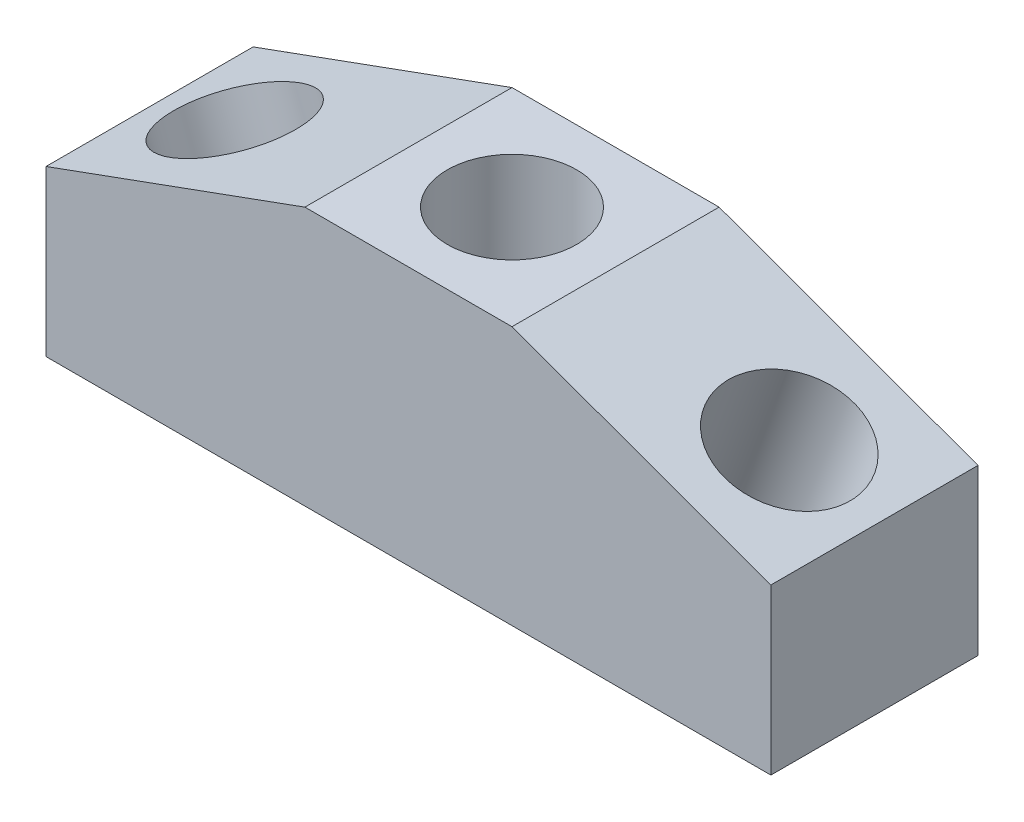
ISO-10303-21;
HEADER;
FILE_DESCRIPTION(('STEP AP214'),'2;1');
FILE_NAME('part.step','',(''),(''),'','','');
FILE_SCHEMA(('AUTOMOTIVE_DESIGN { 1 0 10303 214 1 1 1 1 }'));
ENDSEC;
DATA;
#1=APPLICATION_CONTEXT('core data for automotive mechanical design processes');
#2=APPLICATION_PROTOCOL_DEFINITION('international standard','automotive_design',2000,#1);
#3=PRODUCT_CONTEXT('',#1,'mechanical');
#4=PRODUCT('Part','Part','',(#3));
#5=PRODUCT_RELATED_PRODUCT_CATEGORY('part','',(#4));
#6=PRODUCT_DEFINITION_FORMATION('','',#4);
#7=PRODUCT_DEFINITION_CONTEXT('part definition',#1,'design');
#8=PRODUCT_DEFINITION('design','',#6,#7);
#9=PRODUCT_DEFINITION_SHAPE('','',#8);
#10=(LENGTH_UNIT() NAMED_UNIT(*) SI_UNIT(.MILLI.,.METRE.));
#11=(NAMED_UNIT(*) PLANE_ANGLE_UNIT() SI_UNIT($,.RADIAN.));
#12=(NAMED_UNIT(*) SI_UNIT($,.STERADIAN.) SOLID_ANGLE_UNIT());
#13=UNCERTAINTY_MEASURE_WITH_UNIT(LENGTH_MEASURE(1.E-05),#10,'distance_accuracy_value','');
#14=(GEOMETRIC_REPRESENTATION_CONTEXT(3) GLOBAL_UNCERTAINTY_ASSIGNED_CONTEXT((#13)) GLOBAL_UNIT_ASSIGNED_CONTEXT((#10,
#11,#12)) REPRESENTATION_CONTEXT('',''));
#15=CARTESIAN_POINT('',(0.,0.,0.));
#16=DIRECTION('',(0.,0.,1.));
#17=DIRECTION('',(1.,0.,0.));
#18=AXIS2_PLACEMENT_3D('',#15,#16,#17);
#19=CARTESIAN_POINT('',(0.,6.36029765733801,-8.));
#20=DIRECTION('',(-1.,0.,0.));
#21=DIRECTION('',(0.,0.,1.));
#22=AXIS2_PLACEMENT_3D('',#19,#20,#21);
#23=PLANE('',#22);
#24=DIRECTION('',(0.,-1.,0.));
#25=VECTOR('',#24,1.);
#26=CARTESIAN_POINT('',(0.,6.36029765733801,0.));
#27=LINE('',#26,#25);
#28=CARTESIAN_POINT('',(0.,6.36029765733801,0.));
#29=VERTEX_POINT('',#28);
#30=CARTESIAN_POINT('',(0.,0.,0.));
#31=VERTEX_POINT('',#30);
#32=EDGE_CURVE('E121',#29,#31,#27,.T.);
#33=ORIENTED_EDGE('',*,*,#32,.F.);
#34=DIRECTION('',(0.,0.,1.));
#35=VECTOR('',#34,1.);
#36=CARTESIAN_POINT('',(0.,6.36029765733801,-8.));
#37=LINE('',#36,#35);
#38=CARTESIAN_POINT('',(0.,6.36029765733801,-8.));
#39=VERTEX_POINT('',#38);
#40=EDGE_CURVE('E11',#39,#29,#37,.T.);
#41=ORIENTED_EDGE('',*,*,#40,.F.);
#42=DIRECTION('',(0.,-1.,0.));
#43=VECTOR('',#42,1.);
#44=CARTESIAN_POINT('',(0.,6.36029765733801,-8.));
#45=LINE('',#44,#43);
#46=CARTESIAN_POINT('',(0.,0.,-8.));
#47=VERTEX_POINT('',#46);
#48=EDGE_CURVE('E136',#39,#47,#45,.T.);
#49=ORIENTED_EDGE('',*,*,#48,.T.);
#50=DIRECTION('',(0.,0.,1.));
#51=VECTOR('',#50,1.);
#52=CARTESIAN_POINT('',(0.,0.,-8.));
#53=LINE('',#52,#51);
#54=EDGE_CURVE('E85',#47,#31,#53,.T.);
#55=ORIENTED_EDGE('',*,*,#54,.T.);
#56=EDGE_LOOP('',(#33,#41,#49,#55));
#57=FACE_BOUND('',#56,.T.);
#58=ADVANCED_FACE('F35',(#57),#23,.T.);
#59=CARTESIAN_POINT('',(10.,10.,-8.));
#60=DIRECTION('',(-0.342020143325666,0.939692620785909,0.));
#61=DIRECTION('',(-0.939692620785909,-0.342020143325666,0.));
#62=AXIS2_PLACEMENT_3D('',#59,#60,#61);
#63=PLANE('',#62);
#64=CARTESIAN_POINT('',(3.28892417275068,7.55736815897784,-4.));
#65=DIRECTION('',(-0.342020143325666,0.939692620785909,0.));
#66=DIRECTION('',(-0.939692620785909,-0.342020143325666,0.));
#67=AXIS2_PLACEMENT_3D('',#64,#65,#66);
#68=CIRCLE('',#67,2.49999999999999);
#69=CARTESIAN_POINT('',(0.939692620785918,6.70231780066368,-4.));
#70=VERTEX_POINT('',#69);
#71=EDGE_CURVE('E155',#70,#70,#68,.T.);
#72=ORIENTED_EDGE('',*,*,#71,.F.);
#73=EDGE_LOOP('',(#72));
#74=FACE_BOUND('',#73,.T.);
#75=DIRECTION('',(-0.939692620785909,-0.342020143325666,0.));
#76=VECTOR('',#75,1.);
#77=CARTESIAN_POINT('',(10.,10.,0.));
#78=LINE('',#77,#76);
#79=CARTESIAN_POINT('',(10.,10.,0.));
#80=VERTEX_POINT('',#79);
#81=EDGE_CURVE('E134',#80,#29,#78,.T.);
#82=ORIENTED_EDGE('',*,*,#81,.F.);
#83=DIRECTION('',(0.,0.,1.));
#84=VECTOR('',#83,1.);
#85=CARTESIAN_POINT('',(10.,10.,-8.));
#86=LINE('',#85,#84);
#87=CARTESIAN_POINT('',(10.,10.,-8.));
#88=VERTEX_POINT('',#87);
#89=EDGE_CURVE('E44',#88,#80,#86,.T.);
#90=ORIENTED_EDGE('',*,*,#89,.F.);
#91=DIRECTION('',(-0.939692620785909,-0.342020143325666,0.));
#92=VECTOR('',#91,1.);
#93=CARTESIAN_POINT('',(10.,10.,-8.));
#94=LINE('',#93,#92);
#95=EDGE_CURVE('E111',#88,#39,#94,.T.);
#96=ORIENTED_EDGE('',*,*,#95,.T.);
#97=ORIENTED_EDGE('',*,*,#40,.T.);
#98=EDGE_LOOP('',(#82,#90,#96,#97));
#99=FACE_BOUND('',#98,.T.);
#100=ADVANCED_FACE('F164',(#74,#99),#63,.T.);
#101=CARTESIAN_POINT('',(10.,10.,-8.));
#102=DIRECTION('',(0.,1.,0.));
#103=DIRECTION('',(0.,0.,1.));
#104=AXIS2_PLACEMENT_3D('',#101,#102,#103);
#105=PLANE('',#104);
#106=CARTESIAN_POINT('',(14.,10.,-4.));
#107=DIRECTION('',(0.,1.,0.));
#108=DIRECTION('',(0.,0.,1.));
#109=AXIS2_PLACEMENT_3D('',#106,#107,#108);
#110=CIRCLE('',#109,2.5);
#111=CARTESIAN_POINT('',(14.,10.,-1.5));
#112=VERTEX_POINT('',#111);
#113=EDGE_CURVE('E144',#112,#112,#110,.T.);
#114=ORIENTED_EDGE('',*,*,#113,.F.);
#115=EDGE_LOOP('',(#114));
#116=FACE_BOUND('',#115,.T.);
#117=DIRECTION('',(-1.,0.,0.));
#118=VECTOR('',#117,1.);
#119=CARTESIAN_POINT('',(10.,10.,0.));
#120=LINE('',#119,#118);
#121=CARTESIAN_POINT('',(18.,10.,0.));
#122=VERTEX_POINT('',#121);
#123=EDGE_CURVE('E98',#122,#80,#120,.T.);
#124=ORIENTED_EDGE('',*,*,#123,.F.);
#125=DIRECTION('',(0.,0.,1.));
#126=VECTOR('',#125,1.);
#127=CARTESIAN_POINT('',(18.,10.,-8.));
#128=LINE('',#127,#126);
#129=CARTESIAN_POINT('',(18.,10.,-8.));
#130=VERTEX_POINT('',#129);
#131=EDGE_CURVE('E93',#130,#122,#128,.T.);
#132=ORIENTED_EDGE('',*,*,#131,.F.);
#133=DIRECTION('',(-1.,0.,0.));
#134=VECTOR('',#133,1.);
#135=CARTESIAN_POINT('',(10.,10.,-8.));
#136=LINE('',#135,#134);
#137=EDGE_CURVE('E96',#130,#88,#136,.T.);
#138=ORIENTED_EDGE('',*,*,#137,.T.);
#139=ORIENTED_EDGE('',*,*,#89,.T.);
#140=EDGE_LOOP('',(#124,#132,#138,#139));
#141=FACE_BOUND('',#140,.T.);
#142=ADVANCED_FACE('F95',(#116,#141),#105,.T.);
#143=CARTESIAN_POINT('',(18.,10.,-8.));
#144=DIRECTION('',(0.342020143325666,0.939692620785909,0.));
#145=DIRECTION('',(-0.939692620785909,0.342020143325666,0.));
#146=AXIS2_PLACEMENT_3D('',#143,#144,#145);
#147=PLANE('',#146);
#148=CARTESIAN_POINT('',(24.7110758272493,7.55736815897784,-4.));
#149=DIRECTION('',(0.342020143325666,0.939692620785909,0.));
#150=DIRECTION('',(-0.939692620785909,0.342020143325666,0.));
#151=AXIS2_PLACEMENT_3D('',#148,#149,#150);
#152=CIRCLE('',#151,2.49999999999999);
#153=CARTESIAN_POINT('',(22.3618442752846,8.412418517292,-4.));
#154=VERTEX_POINT('',#153);
#155=EDGE_CURVE('E145',#154,#154,#152,.T.);
#156=ORIENTED_EDGE('',*,*,#155,.F.);
#157=EDGE_LOOP('',(#156));
#158=FACE_BOUND('',#157,.T.);
#159=DIRECTION('',(-0.939692620785909,0.342020143325666,0.));
#160=VECTOR('',#159,1.);
#161=CARTESIAN_POINT('',(18.,10.,0.));
#162=LINE('',#161,#160);
#163=CARTESIAN_POINT('',(28.,6.36029765733801,0.));
#164=VERTEX_POINT('',#163);
#165=EDGE_CURVE('E131',#164,#122,#162,.T.);
#166=ORIENTED_EDGE('',*,*,#165,.F.);
#167=DIRECTION('',(0.,0.,1.));
#168=VECTOR('',#167,1.);
#169=CARTESIAN_POINT('',(28.,6.36029765733801,-8.));
#170=LINE('',#169,#168);
#171=CARTESIAN_POINT('',(28.,6.36029765733801,-8.));
#172=VERTEX_POINT('',#171);
#173=EDGE_CURVE('E103',#172,#164,#170,.T.);
#174=ORIENTED_EDGE('',*,*,#173,.F.);
#175=DIRECTION('',(-0.939692620785909,0.342020143325666,0.));
#176=VECTOR('',#175,1.);
#177=CARTESIAN_POINT('',(18.,10.,-8.));
#178=LINE('',#177,#176);
#179=EDGE_CURVE('E109',#172,#130,#178,.T.);
#180=ORIENTED_EDGE('',*,*,#179,.T.);
#181=ORIENTED_EDGE('',*,*,#131,.T.);
#182=EDGE_LOOP('',(#166,#174,#180,#181));
#183=FACE_BOUND('',#182,.T.);
#184=ADVANCED_FACE('F113',(#158,#183),#147,.T.);
#185=CARTESIAN_POINT('',(28.,6.36029765733801,-8.));
#186=DIRECTION('',(1.,0.,0.));
#187=DIRECTION('',(0.,0.,-1.));
#188=AXIS2_PLACEMENT_3D('',#185,#186,#187);
#189=PLANE('',#188);
#190=DIRECTION('',(0.,1.,0.));
#191=VECTOR('',#190,1.);
#192=CARTESIAN_POINT('',(28.,6.36029765733801,0.));
#193=LINE('',#192,#191);
#194=CARTESIAN_POINT('',(28.,0.,0.));
#195=VERTEX_POINT('',#194);
#196=EDGE_CURVE('E128',#195,#164,#193,.T.);
#197=ORIENTED_EDGE('',*,*,#196,.F.);
#198=DIRECTION('',(0.,0.,1.));
#199=VECTOR('',#198,1.);
#200=CARTESIAN_POINT('',(28.,0.,-8.));
#201=LINE('',#200,#199);
#202=CARTESIAN_POINT('',(28.,0.,-8.));
#203=VERTEX_POINT('',#202);
#204=EDGE_CURVE('E140',#203,#195,#201,.T.);
#205=ORIENTED_EDGE('',*,*,#204,.F.);
#206=DIRECTION('',(0.,1.,0.));
#207=VECTOR('',#206,1.);
#208=CARTESIAN_POINT('',(28.,6.36029765733801,-8.));
#209=LINE('',#208,#207);
#210=EDGE_CURVE('E114',#203,#172,#209,.T.);
#211=ORIENTED_EDGE('',*,*,#210,.T.);
#212=ORIENTED_EDGE('',*,*,#173,.T.);
#213=EDGE_LOOP('',(#197,#205,#211,#212));
#214=FACE_BOUND('',#213,.T.);
#215=ADVANCED_FACE('F180',(#214),#189,.T.);
#216=CARTESIAN_POINT('',(0.,0.,-8.));
#217=DIRECTION('',(0.,-1.,0.));
#218=DIRECTION('',(0.,0.,-1.));
#219=AXIS2_PLACEMENT_3D('',#216,#217,#218);
#220=PLANE('',#219);
#221=CARTESIAN_POINT('',(6.03958123200976,0.,-4.));
#222=DIRECTION('',(0.,-1.,0.));
#223=DIRECTION('',(-1.,0.,0.));
#224=AXIS2_PLACEMENT_3D('',#221,#222,#223);
#225=ELLIPSE('',#224,2.66044443118977,2.49999999999999);
#226=CARTESIAN_POINT('',(3.37913680081999,0.,-4.));
#227=VERTEX_POINT('',#226);
#228=EDGE_CURVE('E38',#227,#227,#225,.T.);
#229=ORIENTED_EDGE('',*,*,#228,.F.);
#230=EDGE_LOOP('',(#229));
#231=FACE_BOUND('',#230,.T.);
#232=CARTESIAN_POINT('',(21.9604187679902,0.,-4.));
#233=DIRECTION('',(0.,-1.,0.));
#234=DIRECTION('',(1.,0.,0.));
#235=AXIS2_PLACEMENT_3D('',#232,#233,#234);
#236=ELLIPSE('',#235,2.66044443118977,2.49999999999999);
#237=CARTESIAN_POINT('',(24.62086319918,0.,-4.));
#238=VERTEX_POINT('',#237);
#239=EDGE_CURVE('E142',#238,#238,#236,.T.);
#240=ORIENTED_EDGE('',*,*,#239,.F.);
#241=EDGE_LOOP('',(#240));
#242=FACE_BOUND('',#241,.T.);
#243=CARTESIAN_POINT('',(14.,0.,-4.));
#244=DIRECTION('',(0.,1.,0.));
#245=DIRECTION('',(0.,0.,1.));
#246=AXIS2_PLACEMENT_3D('',#243,#244,#245);
#247=CIRCLE('',#246,2.5);
#248=CARTESIAN_POINT('',(14.,0.,-1.5));
#249=VERTEX_POINT('',#248);
#250=EDGE_CURVE('E125',#249,#249,#247,.T.);
#251=ORIENTED_EDGE('',*,*,#250,.T.);
#252=EDGE_LOOP('',(#251));
#253=FACE_BOUND('',#252,.T.);
#254=DIRECTION('',(1.,0.,0.));
#255=VECTOR('',#254,1.);
#256=CARTESIAN_POINT('',(0.,0.,0.));
#257=LINE('',#256,#255);
#258=EDGE_CURVE('E124',#31,#195,#257,.T.);
#259=ORIENTED_EDGE('',*,*,#258,.F.);
#260=ORIENTED_EDGE('',*,*,#54,.F.);
#261=DIRECTION('',(1.,0.,0.));
#262=VECTOR('',#261,1.);
#263=CARTESIAN_POINT('',(0.,0.,-8.));
#264=LINE('',#263,#262);
#265=EDGE_CURVE('E116',#47,#203,#264,.T.);
#266=ORIENTED_EDGE('',*,*,#265,.T.);
#267=ORIENTED_EDGE('',*,*,#204,.T.);
#268=EDGE_LOOP('',(#259,#260,#266,#267));
#269=FACE_BOUND('',#268,.T.);
#270=ADVANCED_FACE('F160',(#231,#242,#253,#269),#220,.T.);
#271=CARTESIAN_POINT('',(0.,0.,-8.));
#272=DIRECTION('',(0.,0.,1.));
#273=DIRECTION('',(1.,0.,0.));
#274=AXIS2_PLACEMENT_3D('',#271,#272,#273);
#275=PLANE('',#274);
#276=ORIENTED_EDGE('',*,*,#48,.F.);
#277=ORIENTED_EDGE('',*,*,#95,.F.);
#278=ORIENTED_EDGE('',*,*,#137,.F.);
#279=ORIENTED_EDGE('',*,*,#179,.F.);
#280=ORIENTED_EDGE('',*,*,#210,.F.);
#281=ORIENTED_EDGE('',*,*,#265,.F.);
#282=EDGE_LOOP('',(#276,#277,#278,#279,#280,#281));
#283=FACE_BOUND('',#282,.T.);
#284=ADVANCED_FACE('F107',(#283),#275,.F.);
#285=CARTESIAN_POINT('',(0.,0.,0.));
#286=DIRECTION('',(0.,0.,1.));
#287=DIRECTION('',(1.,0.,0.));
#288=AXIS2_PLACEMENT_3D('',#285,#286,#287);
#289=PLANE('',#288);
#290=ORIENTED_EDGE('',*,*,#32,.T.);
#291=ORIENTED_EDGE('',*,*,#258,.T.);
#292=ORIENTED_EDGE('',*,*,#196,.T.);
#293=ORIENTED_EDGE('',*,*,#165,.T.);
#294=ORIENTED_EDGE('',*,*,#123,.T.);
#295=ORIENTED_EDGE('',*,*,#81,.T.);
#296=EDGE_LOOP('',(#290,#291,#292,#293,#294,#295));
#297=FACE_BOUND('',#296,.T.);
#298=ADVANCED_FACE('F163',(#297),#289,.T.);
#299=CARTESIAN_POINT('',(14.,10.,-4.));
#300=DIRECTION('',(0.,1.,0.));
#301=DIRECTION('',(0.,0.,1.));
#302=AXIS2_PLACEMENT_3D('',#299,#300,#301);
#303=CYLINDRICAL_SURFACE('',#302,2.5);
#304=ORIENTED_EDGE('',*,*,#250,.F.);
#305=EDGE_LOOP('',(#304));
#306=FACE_BOUND('',#305,.T.);
#307=ORIENTED_EDGE('',*,*,#113,.T.);
#308=EDGE_LOOP('',(#307));
#309=FACE_BOUND('',#308,.T.);
#310=ADVANCED_FACE('F194',(#306,#309),#303,.F.);
#311=CARTESIAN_POINT('',(24.7110758272493,7.55736815897784,-4.));
#312=DIRECTION('',(0.342020143325666,0.939692620785909,0.));
#313=DIRECTION('',(-0.939692620785909,0.342020143325666,0.));
#314=AXIS2_PLACEMENT_3D('',#311,#312,#313);
#315=CYLINDRICAL_SURFACE('',#314,2.49999999999999);
#316=ORIENTED_EDGE('',*,*,#239,.T.);
#317=EDGE_LOOP('',(#316));
#318=FACE_BOUND('',#317,.T.);
#319=ORIENTED_EDGE('',*,*,#155,.T.);
#320=EDGE_LOOP('',(#319));
#321=FACE_BOUND('',#320,.T.);
#322=ADVANCED_FACE('F197',(#318,#321),#315,.F.);
#323=CARTESIAN_POINT('',(3.28892417275068,7.55736815897784,-4.));
#324=DIRECTION('',(-0.342020143325666,0.939692620785909,0.));
#325=DIRECTION('',(-0.939692620785909,-0.342020143325666,0.));
#326=AXIS2_PLACEMENT_3D('',#323,#324,#325);
#327=CYLINDRICAL_SURFACE('',#326,2.49999999999999);
#328=ORIENTED_EDGE('',*,*,#228,.T.);
#329=EDGE_LOOP('',(#328));
#330=FACE_BOUND('',#329,.T.);
#331=ORIENTED_EDGE('',*,*,#71,.T.);
#332=EDGE_LOOP('',(#331));
#333=FACE_BOUND('',#332,.T.);
#334=ADVANCED_FACE('F204',(#330,#333),#327,.F.);
#335=CLOSED_SHELL('',(#58,#100,#142,#184,#215,#270,#284,#298,#310,#322,#334));
#336=MANIFOLD_SOLID_BREP('B2',#335);
#337=ADVANCED_BREP_SHAPE_REPRESENTATION('',(#18,#336),#14);
#338=SHAPE_DEFINITION_REPRESENTATION(#9,#337);
ENDSEC;
END-ISO-10303-21;
